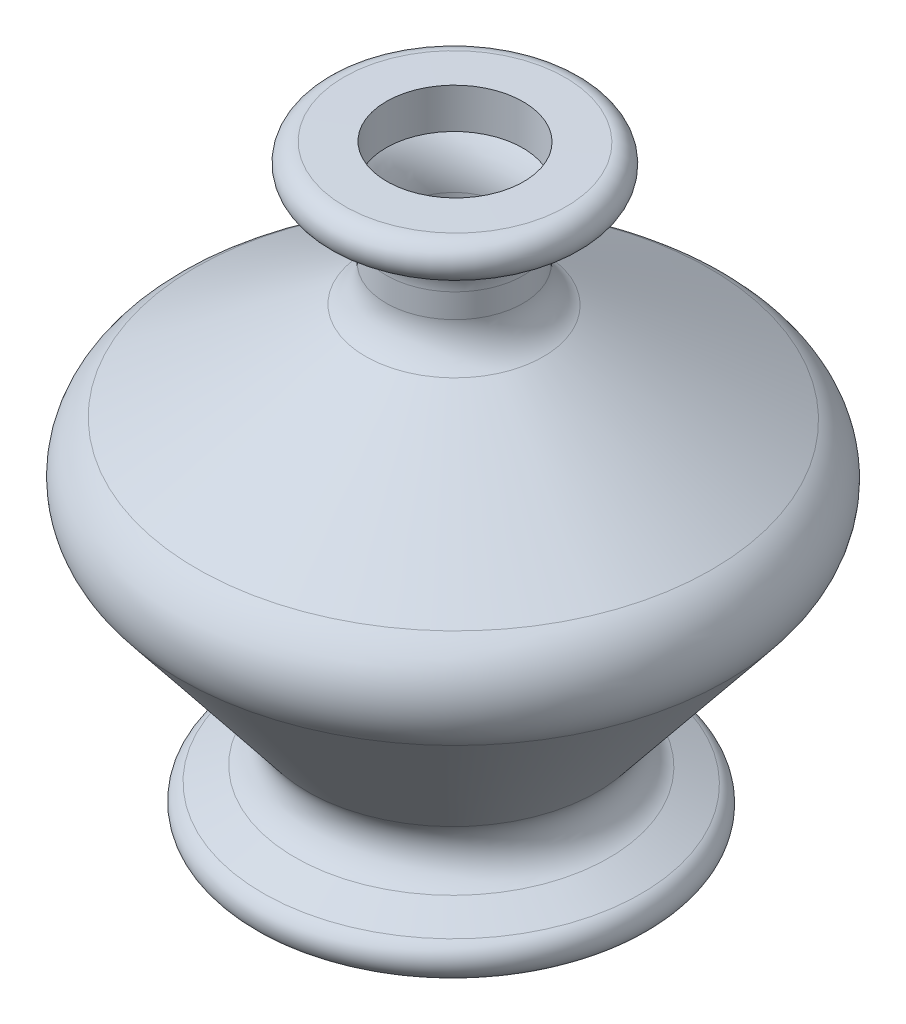
ISO-10303-21;
HEADER;
FILE_DESCRIPTION(('STEP AP214'),'2;1');
FILE_NAME('part.step','',(''),(''),'','','');
FILE_SCHEMA(('AUTOMOTIVE_DESIGN { 1 0 10303 214 1 1 1 1 }'));
ENDSEC;
DATA;
#1=APPLICATION_CONTEXT('core data for automotive mechanical design processes');
#2=APPLICATION_PROTOCOL_DEFINITION('international standard','automotive_design',2000,#1);
#3=PRODUCT_CONTEXT('',#1,'mechanical');
#4=PRODUCT('Part','Part','',(#3));
#5=PRODUCT_RELATED_PRODUCT_CATEGORY('part','',(#4));
#6=PRODUCT_DEFINITION_FORMATION('','',#4);
#7=PRODUCT_DEFINITION_CONTEXT('part definition',#1,'design');
#8=PRODUCT_DEFINITION('design','',#6,#7);
#9=PRODUCT_DEFINITION_SHAPE('','',#8);
#10=(LENGTH_UNIT() NAMED_UNIT(*) SI_UNIT(.MILLI.,.METRE.));
#11=(NAMED_UNIT(*) PLANE_ANGLE_UNIT() SI_UNIT($,.RADIAN.));
#12=(NAMED_UNIT(*) SI_UNIT($,.STERADIAN.) SOLID_ANGLE_UNIT());
#13=UNCERTAINTY_MEASURE_WITH_UNIT(LENGTH_MEASURE(1.E-05),#10,'distance_accuracy_value','');
#14=(GEOMETRIC_REPRESENTATION_CONTEXT(3) GLOBAL_UNCERTAINTY_ASSIGNED_CONTEXT((#13)) GLOBAL_UNIT_ASSIGNED_CONTEXT((#10,
#11,#12)) REPRESENTATION_CONTEXT('',''));
#15=CARTESIAN_POINT('',(0.,0.,0.));
#16=DIRECTION('',(0.,0.,1.));
#17=DIRECTION('',(1.,0.,0.));
#18=AXIS2_PLACEMENT_3D('',#15,#16,#17);
#19=CARTESIAN_POINT('',(-1.06157522456295,-98.6303173315967,0.));
#20=DIRECTION('',(0.00682786330255889,0.99997668986968,0.));
#21=DIRECTION('',(-0.99997668986968,0.00682786330255889,0.));
#22=AXIS2_PLACEMENT_3D('',#19,#20,#21);
#23=CYLINDRICAL_SURFACE('',#22,14.1554701523642);
#24=CARTESIAN_POINT('',(-0.195224617022716,28.2513108448182,0.));
#25=DIRECTION('',(0.00682786330255889,0.99997668986968,0.));
#26=DIRECTION('',(-0.99997668986968,0.00682786330255889,0.));
#27=AXIS2_PLACEMENT_3D('',#24,#25,#26);
#28=CIRCLE('',#27,14.1554701523587);
#29=CARTESIAN_POINT('',(-14.3503648035274,28.347962460002,0.));
#30=VERTEX_POINT('',#29);
#31=EDGE_CURVE('E145',#30,#30,#28,.T.);
#32=ORIENTED_EDGE('',*,*,#31,.F.);
#33=EDGE_LOOP('',(#32));
#34=FACE_BOUND('',#33,.T.);
#35=CARTESIAN_POINT('',(-0.150675963278453,34.7756967815788,0.));
#36=DIRECTION('',(0.00682786330255889,0.99997668986968,0.));
#37=DIRECTION('',(-0.99997668986968,0.00682786330255889,0.));
#38=AXIS2_PLACEMENT_3D('',#35,#36,#37);
#39=CIRCLE('',#38,14.1554701523697);
#40=CARTESIAN_POINT('',(-14.3058161497942,34.8723483967626,0.));
#41=VERTEX_POINT('',#40);
#42=EDGE_CURVE('E11',#41,#41,#39,.T.);
#43=ORIENTED_EDGE('',*,*,#42,.T.);
#44=EDGE_LOOP('',(#43));
#45=FACE_BOUND('',#44,.T.);
#46=ADVANCED_FACE('F43',(#34,#45),#23,.F.);
#47=CARTESIAN_POINT('',(-0.150675963278644,34.7756967815509,0.));
#48=DIRECTION('',(0.00682786330255889,0.99997668986968,0.));
#49=DIRECTION('',(-0.99997668986968,0.00682786330255889,0.));
#50=AXIS2_PLACEMENT_3D('',#47,#48,#49);
#51=TOROIDAL_SURFACE('',#50,30.5554701523697,16.4);
#52=CARTESIAN_POINT('',(-0.074350345880984,45.953987098079,0.));
#53=DIRECTION('',(0.00682786330255889,0.99997668986968,0.));
#54=DIRECTION('',(-0.99997668986968,0.00682786330255889,0.));
#55=AXIS2_PLACEMENT_3D('',#52,#53,#54);
#56=CIRCLE('',#55,18.5554701523887);
#57=CARTESIAN_POINT('',(-18.6293879678423,46.0806813117942,0.));
#58=VERTEX_POINT('',#57);
#59=EDGE_CURVE('E50',#58,#58,#56,.T.);
#60=ORIENTED_EDGE('',*,*,#59,.T.);
#61=EDGE_LOOP('',(#60));
#62=FACE_BOUND('',#61,.T.);
#63=ORIENTED_EDGE('',*,*,#42,.F.);
#64=EDGE_LOOP('',(#63));
#65=FACE_BOUND('',#64,.T.);
#66=ADVANCED_FACE('F111',(#62,#65),#51,.T.);
#67=CARTESIAN_POINT('',(-1.06157522456295,-98.6303173315967,0.));
#68=DIRECTION('',(0.00682786330255889,0.99997668986968,0.));
#69=DIRECTION('',(-0.99997668986968,0.00682786330255889,0.));
#70=AXIS2_PLACEMENT_3D('',#67,#68,#69);
#71=CYLINDRICAL_SURFACE('',#70,18.5554701523979);
#72=ORIENTED_EDGE('',*,*,#59,.F.);
#73=EDGE_LOOP('',(#72));
#74=FACE_BOUND('',#73,.T.);
#75=CARTESIAN_POINT('',(5.56011400115741E-11,56.8429884628937,0.));
#76=DIRECTION('',(0.00682786330255889,0.99997668986968,0.));
#77=DIRECTION('',(-0.99997668986968,0.00682786330255889,0.));
#78=AXIS2_PLACEMENT_3D('',#75,#76,#77);
#79=CIRCLE('',#78,18.5554701524072);
#80=CARTESIAN_POINT('',(-18.5550376219242,56.969682676609,0.));
#81=VERTEX_POINT('',#80);
#82=EDGE_CURVE('E106',#81,#81,#79,.T.);
#83=ORIENTED_EDGE('',*,*,#82,.T.);
#84=EDGE_LOOP('',(#83));
#85=FACE_BOUND('',#84,.T.);
#86=ADVANCED_FACE('F114',(#74,#85),#71,.F.);
#87=CARTESIAN_POINT('',(-0.00053356085472642,56.764845645835,0.));
#88=DIRECTION('',(-0.00682786330255889,-0.99997668986968,0.));
#89=DIRECTION('',(0.99997668986968,-0.00682786330255889,0.));
#90=AXIS2_PLACEMENT_3D('',#87,#88,#89);
#91=CONICAL_SURFACE('',#90,30.0001657469065,1.56396841043905);
#92=ORIENTED_EDGE('',*,*,#82,.F.);
#93=EDGE_LOOP('',(#92));
#94=FACE_BOUND('',#93,.T.);
#95=CARTESIAN_POINT('',(-0.00053356085472642,56.764845645835,0.));
#96=DIRECTION('',(0.00682786330255889,0.99997668986968,0.));
#97=DIRECTION('',(-0.99997668986968,0.00682786330255889,0.));
#98=AXIS2_PLACEMENT_3D('',#95,#96,#97);
#99=CIRCLE('',#98,30.0001657469065);
#100=CARTESIAN_POINT('',(-29.9999999999881,56.969682676609,0.));
#101=VERTEX_POINT('',#100);
#102=EDGE_CURVE('E103',#101,#101,#99,.T.);
#103=ORIENTED_EDGE('',*,*,#102,.T.);
#104=EDGE_LOOP('',(#103));
#105=FACE_BOUND('',#104,.T.);
#106=ADVANCED_FACE('F117',(#94,#105),#91,.T.);
#107=CARTESIAN_POINT('',(-0.0346720815756034,51.7650787444214,0.));
#108=DIRECTION('',(0.00682786330255889,0.99997668986968,0.));
#109=DIRECTION('',(-0.99997668986968,0.00682786330255889,0.));
#110=AXIS2_PLACEMENT_3D('',#107,#108,#109);
#111=TOROIDAL_SURFACE('',#110,29.9660264303937,5.);
#112=CARTESIAN_POINT('',(-0.0688106022964814,46.7653118430079,0.));
#113=DIRECTION('',(0.00682786330255889,0.99997668986968,0.));
#114=DIRECTION('',(-0.99997668986968,0.00682786330255889,0.));
#115=AXIS2_PLACEMENT_3D('',#112,#113,#114);
#116=CIRCLE('',#115,29.9318871138809);
#117=CARTESIAN_POINT('',(-29.9999999999881,46.9696826766091,0.));
#118=VERTEX_POINT('',#117);
#119=EDGE_CURVE('E100',#118,#118,#116,.T.);
#120=ORIENTED_EDGE('',*,*,#119,.T.);
#121=EDGE_LOOP('',(#120));
#122=FACE_BOUND('',#121,.T.);
#123=ORIENTED_EDGE('',*,*,#102,.F.);
#124=EDGE_LOOP('',(#123));
#125=FACE_BOUND('',#124,.T.);
#126=ADVANCED_FACE('F123',(#122,#125),#111,.T.);
#127=CARTESIAN_POINT('',(-0.0688158611971046,46.7645416491998,0.));
#128=DIRECTION('',(-0.00682786330255889,-0.99997668986968,0.));
#129=DIRECTION('',(0.99997668986968,-0.00682786330255889,0.));
#130=AXIS2_PLACEMENT_3D('',#127,#128,#129);
#131=CONICAL_SURFACE('',#130,30.0446886996562,1.56396841043884);
#132=ORIENTED_EDGE('',*,*,#119,.F.);
#133=EDGE_LOOP('',(#132));
#134=FACE_BOUND('',#133,.T.);
#135=CARTESIAN_POINT('',(-0.0688158611971046,46.7645416491998,0.));
#136=DIRECTION('',(0.00682786330255889,0.99997668986968,0.));
#137=DIRECTION('',(-0.99997668986968,0.00682786330255889,0.));
#138=AXIS2_PLACEMENT_3D('',#135,#136,#137);
#139=CIRCLE('',#138,30.0446886996562);
#140=CARTESIAN_POINT('',(-30.1128042152443,46.969682676609,0.));
#141=VERTEX_POINT('',#140);
#142=EDGE_CURVE('E97',#141,#141,#139,.T.);
#143=ORIENTED_EDGE('',*,*,#142,.T.);
#144=EDGE_LOOP('',(#143));
#145=FACE_BOUND('',#144,.T.);
#146=ADVANCED_FACE('F128',(#134,#145),#131,.T.);
#147=CARTESIAN_POINT('',(-0.150675963278644,34.7756967815509,0.));
#148=DIRECTION('',(0.00682786330255889,0.99997668986968,0.));
#149=DIRECTION('',(-0.99997668986968,0.00682786330255889,0.));
#150=AXIS2_PLACEMENT_3D('',#147,#148,#149);
#151=TOROIDAL_SURFACE('',#150,30.5554701523697,12.0000000012208);
#152=ORIENTED_EDGE('',*,*,#142,.F.);
#153=EDGE_LOOP('',(#152));
#154=FACE_BOUND('',#153,.T.);
#155=CARTESIAN_POINT('',(-0.150675963278504,34.7756967815713,0.));
#156=DIRECTION('',(0.00682786330255889,0.99997668986968,0.));
#157=DIRECTION('',(-0.99997668986968,0.00682786330255889,0.));
#158=AXIS2_PLACEMENT_3D('',#155,#156,#157);
#159=CIRCLE('',#158,18.5554701523697);
#160=CARTESIAN_POINT('',(-18.7057135852208,34.9023909952864,0.));
#161=VERTEX_POINT('',#160);
#162=EDGE_CURVE('E94',#161,#161,#159,.T.);
#163=ORIENTED_EDGE('',*,*,#162,.T.);
#164=EDGE_LOOP('',(#163));
#165=FACE_BOUND('',#164,.T.);
#166=ADVANCED_FACE('F134',(#154,#165),#151,.F.);
#167=CARTESIAN_POINT('',(-1.06157522456295,-98.6303173315967,0.));
#168=DIRECTION('',(0.00682786330255889,0.99997668986968,0.));
#169=DIRECTION('',(-0.99997668986968,0.00682786330255889,0.));
#170=AXIS2_PLACEMENT_3D('',#167,#168,#169);
#171=CYLINDRICAL_SURFACE('',#170,18.5554701523642);
#172=CARTESIAN_POINT('',(-0.195224617022771,28.2513108448102,0.));
#173=DIRECTION('',(0.00682786330255889,0.99997668986968,0.));
#174=DIRECTION('',(-0.99997668986968,0.00682786330255889,0.));
#175=AXIS2_PLACEMENT_3D('',#172,#173,#174);
#176=CIRCLE('',#175,18.5554701523587);
#177=CARTESIAN_POINT('',(-18.750262238954,28.3780050585252,0.));
#178=VERTEX_POINT('',#177);
#179=EDGE_CURVE('E91',#178,#178,#176,.T.);
#180=ORIENTED_EDGE('',*,*,#179,.T.);
#181=EDGE_LOOP('',(#180));
#182=FACE_BOUND('',#181,.T.);
#183=ORIENTED_EDGE('',*,*,#162,.F.);
#184=EDGE_LOOP('',(#183));
#185=FACE_BOUND('',#184,.T.);
#186=ADVANCED_FACE('F218',(#182,#185),#171,.T.);
#187=CARTESIAN_POINT('',(-0.195224617022913,28.2513108447897,0.));
#188=DIRECTION('',(0.00682786330255889,0.99997668986968,0.));
#189=DIRECTION('',(-0.99997668986968,0.00682786330255889,0.));
#190=AXIS2_PLACEMENT_3D('',#187,#188,#189);
#191=TOROIDAL_SURFACE('',#190,29.8054701523587,11.25);
#192=ORIENTED_EDGE('',*,*,#179,.F.);
#193=EDGE_LOOP('',(#192));
#194=FACE_BOUND('',#193,.T.);
#195=CARTESIAN_POINT('',(-0.261483240044998,18.5473850939449,0.));
#196=DIRECTION('',(0.00682786330255889,0.99997668986968,0.));
#197=DIRECTION('',(-0.99997668986968,0.00682786330255889,0.));
#198=AXIS2_PLACEMENT_3D('',#195,#196,#197);
#199=CIRCLE('',#198,24.1140788622639);
#200=CARTESIAN_POINT('',(-24.3749999999881,18.7120327280836,0.));
#201=VERTEX_POINT('',#200);
#202=EDGE_CURVE('E88',#201,#201,#199,.T.);
#203=ORIENTED_EDGE('',*,*,#202,.T.);
#204=EDGE_LOOP('',(#203));
#205=FACE_BOUND('',#204,.T.);
#206=ADVANCED_FACE('F214',(#194,#205),#191,.F.);
#207=CARTESIAN_POINT('',(-0.261483240044998,18.5473850939449,0.));
#208=DIRECTION('',(-0.00682786330255889,-0.99997668986968,0.));
#209=DIRECTION('',(0.99997668986968,-0.00682786330255889,0.));
#210=AXIS2_PLACEMENT_3D('',#207,#208,#209);
#211=CONICAL_SURFACE('',#210,24.1140788622639,1.04036963484075);
#212=CARTESIAN_POINT('',(-0.444460106448989,-8.25054466554753,0.));
#213=DIRECTION('',(0.00682786330255889,0.99997668986968,0.));
#214=DIRECTION('',(-0.99997668986968,0.00682786330255889,0.));
#215=AXIS2_PLACEMENT_3D('',#212,#213,#214);
#216=CIRCLE('',#215,69.8071671077132);
#217=CARTESIAN_POINT('',(-70.2499999999996,-7.77391087099718,0.));
#218=VERTEX_POINT('',#217);
#219=EDGE_CURVE('E85',#218,#218,#216,.T.);
#220=ORIENTED_EDGE('',*,*,#219,.T.);
#221=EDGE_LOOP('',(#220));
#222=FACE_BOUND('',#221,.T.);
#223=ORIENTED_EDGE('',*,*,#202,.F.);
#224=EDGE_LOOP('',(#223));
#225=FACE_BOUND('',#224,.T.);
#226=ADVANCED_FACE('F210',(#222,#225),#211,.T.);
#227=CARTESIAN_POINT('',(-0.538694592524848,-22.0516835111935,0.));
#228=DIRECTION('',(0.00682786330255889,0.99997668986968,0.));
#229=DIRECTION('',(-0.99997668986968,0.00682786330255889,0.));
#230=AXIS2_PLACEMENT_3D('',#227,#228,#229);
#231=TOROIDAL_SURFACE('',#230,61.7127439395784,16.);
#232=CARTESIAN_POINT('',(-0.606638386802283,-32.002411504426,0.));
#233=DIRECTION('',(0.00682786330255889,0.99997668986968,0.));
#234=DIRECTION('',(-0.99997668986968,0.00682786330255889,0.));
#235=AXIS2_PLACEMENT_3D('',#232,#233,#234);
#236=CIRCLE('',#235,74.2418459044248);
#237=CARTESIAN_POINT('',(-74.8467537041238,-31.495498329261,0.));
#238=VERTEX_POINT('',#237);
#239=EDGE_CURVE('E82',#238,#238,#236,.T.);
#240=ORIENTED_EDGE('',*,*,#239,.T.);
#241=EDGE_LOOP('',(#240));
#242=FACE_BOUND('',#241,.T.);
#243=ORIENTED_EDGE('',*,*,#219,.F.);
#244=EDGE_LOOP('',(#243));
#245=FACE_BOUND('',#244,.T.);
#246=ADVANCED_FACE('F206',(#242,#245),#231,.T.);
#247=CARTESIAN_POINT('',(-0.606638386802283,-32.002411504426,0.));
#248=DIRECTION('',(0.00682786330255889,0.99997668986968,0.));
#249=DIRECTION('',(-0.99997668986968,0.00682786330255889,0.));
#250=AXIS2_PLACEMENT_3D('',#247,#248,#249);
#251=CONICAL_SURFACE('',#250,74.2418459044248,0.671211328790154);
#252=CARTESIAN_POINT('',(-0.90739084989184,-76.049200255709,0.));
#253=DIRECTION('',(0.00682786330255889,0.99997668986968,0.));
#254=DIRECTION('',(-0.99997668986968,0.00682786330255889,0.));
#255=AXIS2_PLACEMENT_3D('',#252,#253,#254);
#256=CIRCLE('',#255,39.2578502970231);
#257=CARTESIAN_POINT('',(-40.1643260413084,-75.7811530203286,0.));
#258=VERTEX_POINT('',#257);
#259=EDGE_CURVE('E79',#258,#258,#256,.T.);
#260=ORIENTED_EDGE('',*,*,#259,.T.);
#261=EDGE_LOOP('',(#260));
#262=FACE_BOUND('',#261,.T.);
#263=ORIENTED_EDGE('',*,*,#239,.F.);
#264=EDGE_LOOP('',(#263));
#265=FACE_BOUND('',#264,.T.);
#266=ADVANCED_FACE('F202',(#262,#265),#251,.T.);
#267=CARTESIAN_POINT('',(-0.945609234172896,-81.6464847519023,0.));
#268=DIRECTION('',(0.00682786330255889,0.99997668986968,0.));
#269=DIRECTION('',(-0.99997668986968,0.00682786330255889,0.));
#270=AXIS2_PLACEMENT_3D('',#267,#268,#269);
#271=TOROIDAL_SURFACE('',#270,46.3054701522492,9.00000000000002);
#272=ORIENTED_EDGE('',*,*,#259,.F.);
#273=EDGE_LOOP('',(#272));
#274=FACE_BOUND('',#273,.T.);
#275=CARTESIAN_POINT('',(-1.00147937860931,-89.8289628743219,0.));
#276=DIRECTION('',(0.00682786330255889,0.99997668986968,0.));
#277=DIRECTION('',(-0.99997668986968,0.00682786330255889,0.));
#278=AXIS2_PLACEMENT_3D('',#275,#276,#277);
#279=CIRCLE('',#278,42.5579469297615);
#280=CARTESIAN_POINT('',(-43.5584342770817,-89.538383030248,0.));
#281=VERTEX_POINT('',#280);
#282=EDGE_CURVE('E70',#281,#281,#279,.T.);
#283=ORIENTED_EDGE('',*,*,#282,.T.);
#284=EDGE_LOOP('',(#283));
#285=FACE_BOUND('',#284,.T.);
#286=ADVANCED_FACE('F198',(#274,#285),#271,.F.);
#287=CARTESIAN_POINT('',(-1.00147937860931,-89.8289628743219,0.));
#288=DIRECTION('',(-0.00682786330255889,-0.99997668986968,0.));
#289=DIRECTION('',(0.99997668986968,-0.00682786330255889,0.));
#290=AXIS2_PLACEMENT_3D('',#287,#288,#289);
#291=CONICAL_SURFACE('',#290,42.5579469297615,1.14132360225847);
#292=CARTESIAN_POINT('',(-1.02873278340151,-93.8203681359898,0.));
#293=DIRECTION('',(0.00682786330255889,0.99997668986968,0.));
#294=DIRECTION('',(-0.99997668986968,0.00682786330255889,0.));
#295=AXIS2_PLACEMENT_3D('',#292,#293,#294);
#296=CIRCLE('',#295,51.2733322506533);
#297=CARTESIAN_POINT('',(-52.3008698459981,-93.4702808323157,0.));
#298=VERTEX_POINT('',#297);
#299=EDGE_CURVE('E66',#298,#298,#296,.T.);
#300=ORIENTED_EDGE('',*,*,#299,.T.);
#301=EDGE_LOOP('',(#300));
#302=FACE_BOUND('',#301,.T.);
#303=ORIENTED_EDGE('',*,*,#282,.F.);
#304=EDGE_LOOP('',(#303));
#305=FACE_BOUND('',#304,.T.);
#306=ADVANCED_FACE('F195',(#302,#305),#291,.T.);
#307=CARTESIAN_POINT('',(-1.05977175253284,-98.3661893151118,0.));
#308=DIRECTION('',(0.00682786330255889,0.99997668986968,0.));
#309=DIRECTION('',(-0.99997668986968,0.00682786330255889,0.));
#310=AXIS2_PLACEMENT_3D('',#307,#308,#309);
#311=TOROIDAL_SURFACE('',#310,49.1913749048268,4.99999999999999);
#312=CARTESIAN_POINT('',(-1.09391027325372,-103.365956216525,0.));
#313=DIRECTION('',(0.00682786330255889,0.99997668986968,0.));
#314=DIRECTION('',(-0.99997668986968,0.00682786330255889,0.));
#315=AXIS2_PLACEMENT_3D('',#312,#313,#314);
#316=CIRCLE('',#315,49.157235588314);
#317=CARTESIAN_POINT('',(-50.25,-103.030317331597,0.));
#318=VERTEX_POINT('',#317);
#319=EDGE_CURVE('E64',#318,#318,#316,.T.);
#320=ORIENTED_EDGE('',*,*,#319,.T.);
#321=EDGE_LOOP('',(#320));
#322=FACE_BOUND('',#321,.T.);
#323=ORIENTED_EDGE('',*,*,#299,.F.);
#324=EDGE_LOOP('',(#323));
#325=FACE_BOUND('',#324,.T.);
#326=ADVANCED_FACE('F60',(#322,#325),#311,.T.);
#327=CARTESIAN_POINT('',(-1.09391027325372,-103.365956216525,0.));
#328=DIRECTION('',(-0.00682786330255889,-0.99997668986968,0.));
#329=DIRECTION('',(0.99997668986968,-0.00682786330255889,0.));
#330=AXIS2_PLACEMENT_3D('',#327,#328,#329);
#331=CONICAL_SURFACE('',#330,49.157235588314,1.56396841043905);
#332=CARTESIAN_POINT('',(-1.09161852340742,-103.030317331597,0.));
#333=VERTEX_POINT('',#332);
#334=VERTEX_LOOP('',#333);
#335=FACE_BOUND('',#334,.T.);
#336=ORIENTED_EDGE('',*,*,#319,.F.);
#337=EDGE_LOOP('',(#336));
#338=FACE_BOUND('',#337,.T.);
#339=ADVANCED_FACE('F56',(#335,#338),#331,.F.);
#340=CARTESIAN_POINT('',(-1.06386837501935,-98.9661613432815,0.));
#341=DIRECTION('',(-0.00682786330255889,-0.99997668986968,0.));
#342=DIRECTION('',(0.99997668986968,-0.00682786330255889,0.));
#343=AXIS2_PLACEMENT_3D('',#340,#341,#342);
#344=CONICAL_SURFACE('',#343,49.1872781868453,1.56396841043905);
#345=CARTESIAN_POINT('',(-1.06157522456295,-98.6303173315967,0.));
#346=VERTEX_POINT('',#345);
#347=VERTEX_LOOP('',#346);
#348=FACE_BOUND('',#347,.T.);
#349=CARTESIAN_POINT('',(-1.06386837501935,-98.9661613432815,0.));
#350=DIRECTION('',(0.00682786330255889,0.99997668986968,0.));
#351=DIRECTION('',(-0.99997668986968,0.00682786330255889,0.));
#352=AXIS2_PLACEMENT_3D('',#349,#350,#351);
#353=CIRCLE('',#352,49.1872781868453);
#354=CARTESIAN_POINT('',(-50.25,-98.6303173315967,0.));
#355=VERTEX_POINT('',#354);
#356=EDGE_CURVE('E67',#355,#355,#353,.T.);
#357=ORIENTED_EDGE('',*,*,#356,.T.);
#358=EDGE_LOOP('',(#357));
#359=FACE_BOUND('',#358,.T.);
#360=ADVANCED_FACE('F59',(#348,#359),#344,.T.);
#361=CARTESIAN_POINT('',(-1.05977175253284,-98.3661893151118,0.));
#362=DIRECTION('',(0.00682786330255889,0.99997668986968,0.));
#363=DIRECTION('',(-0.99997668986968,0.00682786330255889,0.));
#364=AXIS2_PLACEMENT_3D('',#361,#362,#363);
#365=TOROIDAL_SURFACE('',#364,49.1913749048268,0.600000000000003);
#366=ORIENTED_EDGE('',*,*,#356,.F.);
#367=EDGE_LOOP('',(#366));
#368=FACE_BOUND('',#367,.T.);
#369=CARTESIAN_POINT('',(-1.05604707623708,-97.8206907736172,0.));
#370=DIRECTION('',(0.00682786330255889,0.99997668986968,0.));
#371=DIRECTION('',(-0.99997668986968,0.00682786330255889,0.));
#372=AXIS2_PLACEMENT_3D('',#369,#370,#371);
#373=CIRCLE('',#372,49.441209786326);
#374=CARTESIAN_POINT('',(-50.4961043815198,-97.483112951683,0.));
#375=VERTEX_POINT('',#374);
#376=EDGE_CURVE('E73',#375,#375,#373,.T.);
#377=ORIENTED_EDGE('',*,*,#376,.T.);
#378=EDGE_LOOP('',(#377));
#379=FACE_BOUND('',#378,.T.);
#380=ADVANCED_FACE('F167',(#368,#379),#365,.F.);
#381=CARTESIAN_POINT('',(-1.02879367144488,-93.8292855119493,0.));
#382=DIRECTION('',(-0.00682786330255889,-0.99997668986968,0.));
#383=DIRECTION('',(0.99997668986968,-0.00682786330255889,0.));
#384=AXIS2_PLACEMENT_3D('',#381,#382,#383);
#385=CONICAL_SURFACE('',#384,40.7258244654342,1.14132360225847);
#386=ORIENTED_EDGE('',*,*,#376,.F.);
#387=EDGE_LOOP('',(#386));
#388=FACE_BOUND('',#387,.T.);
#389=CARTESIAN_POINT('',(-1.02879367144488,-93.8292855119493,0.));
#390=DIRECTION('',(0.00682786330255889,0.99997668986968,0.));
#391=DIRECTION('',(-0.99997668986968,0.00682786330255889,0.));
#392=AXIS2_PLACEMENT_3D('',#389,#390,#391);
#393=CIRCLE('',#392,40.7258244654342);
#394=CARTESIAN_POINT('',(-41.7536688126034,-93.5512151496153,0.));
#395=VERTEX_POINT('',#394);
#396=EDGE_CURVE('E162',#395,#395,#393,.T.);
#397=ORIENTED_EDGE('',*,*,#396,.T.);
#398=EDGE_LOOP('',(#397));
#399=FACE_BOUND('',#398,.T.);
#400=ADVANCED_FACE('F169',(#388,#399),#385,.F.);
#401=CARTESIAN_POINT('',(-0.945609234172896,-81.6464847519023,0.));
#402=DIRECTION('',(0.00682786330255889,0.99997668986968,0.));
#403=DIRECTION('',(-0.99997668986968,0.00682786330255889,0.));
#404=AXIS2_PLACEMENT_3D('',#401,#402,#403);
#405=TOROIDAL_SURFACE('',#404,46.3054701522492,13.4);
#406=CARTESIAN_POINT('',(-0.888706306465545,-73.31275005757,0.));
#407=DIRECTION('',(0.00682786330255889,0.99997668986968,0.));
#408=DIRECTION('',(-0.99997668986968,0.00682786330255889,0.));
#409=AXIS2_PLACEMENT_3D('',#406,#407,#408);
#410=CIRCLE('',#409,35.8123472566904);
#411=CARTESIAN_POINT('',(-36.7002187726743,-73.0682282459576,0.));
#412=VERTEX_POINT('',#411);
#413=EDGE_CURVE('E159',#412,#412,#410,.T.);
#414=ORIENTED_EDGE('',*,*,#413,.T.);
#415=EDGE_LOOP('',(#414));
#416=FACE_BOUND('',#415,.T.);
#417=ORIENTED_EDGE('',*,*,#396,.F.);
#418=EDGE_LOOP('',(#417));
#419=FACE_BOUND('',#418,.T.);
#420=ADVANCED_FACE('F172',(#416,#419),#405,.T.);
#421=CARTESIAN_POINT('',(-0.587953843375987,-29.2659613062871,0.));
#422=DIRECTION('',(0.00682786330255889,0.99997668986968,0.));
#423=DIRECTION('',(-0.99997668986968,0.00682786330255889,0.));
#424=AXIS2_PLACEMENT_3D('',#421,#422,#423);
#425=CONICAL_SURFACE('',#424,70.7963428640921,0.671211328790154);
#426=ORIENTED_EDGE('',*,*,#413,.F.);
#427=EDGE_LOOP('',(#426));
#428=FACE_BOUND('',#427,.T.);
#429=CARTESIAN_POINT('',(-0.587953843375987,-29.2659613062871,0.));
#430=DIRECTION('',(0.00682786330255889,0.99997668986968,0.));
#431=DIRECTION('',(-0.99997668986968,0.00682786330255889,0.));
#432=AXIS2_PLACEMENT_3D('',#429,#430,#431);
#433=CIRCLE('',#432,70.796342864092);
#434=CARTESIAN_POINT('',(-71.3826464354897,-28.78257355489,0.));
#435=VERTEX_POINT('',#434);
#436=EDGE_CURVE('E156',#435,#435,#433,.T.);
#437=ORIENTED_EDGE('',*,*,#436,.T.);
#438=EDGE_LOOP('',(#437));
#439=FACE_BOUND('',#438,.T.);
#440=ADVANCED_FACE('F177',(#428,#439),#425,.F.);
#441=CARTESIAN_POINT('',(-0.538694592524848,-22.0516835111935,0.));
#442=DIRECTION('',(0.00682786330255889,0.99997668986968,0.));
#443=DIRECTION('',(-0.99997668986968,0.00682786330255889,0.));
#444=AXIS2_PLACEMENT_3D('',#441,#442,#443);
#445=TOROIDAL_SURFACE('',#444,61.7127439395784,11.6);
#446=ORIENTED_EDGE('',*,*,#436,.F.);
#447=EDGE_LOOP('',(#446));
#448=FACE_BOUND('',#447,.T.);
#449=CARTESIAN_POINT('',(-0.470374590119849,-12.0458578481002,0.));
#450=DIRECTION('',(0.00682786330255889,0.99997668986968,0.));
#451=DIRECTION('',(-0.99997668986968,0.00682786330255889,0.));
#452=AXIS2_PLACEMENT_3D('',#449,#450,#451);
#453=CIRCLE('',#452,67.5812007364761);
#454=CARTESIAN_POINT('',(67.1092508197599,-12.5072930485516,0.));
#455=VERTEX_POINT('',#454);
#456=EDGE_CURVE('E151',#455,#455,#453,.T.);
#457=ORIENTED_EDGE('',*,*,#456,.T.);
#458=EDGE_LOOP('',(#457));
#459=FACE_BOUND('',#458,.T.);
#460=ADVANCED_FACE('F183',(#448,#459),#445,.F.);
#461=CARTESIAN_POINT('',(-0.287397723715859,14.7520719113923,0.));
#462=DIRECTION('',(-0.00682786330255889,-0.99997668986968,0.));
#463=DIRECTION('',(0.99997668986968,-0.00682786330255889,0.));
#464=AXIS2_PLACEMENT_3D('',#461,#462,#463);
#465=CONICAL_SURFACE('',#464,21.8881124910268,1.04036963484075);
#466=CARTESIAN_POINT('',(-0.287397723715859,14.7520719113923,0.));
#467=DIRECTION('',(0.00682786330255889,0.99997668986968,0.));
#468=DIRECTION('',(-0.99997668986968,0.00682786330255889,0.));
#469=AXIS2_PLACEMENT_3D('',#466,#467,#468);
#470=CIRCLE('',#469,21.8881124910268);
#471=CARTESIAN_POINT('',(21.6002045525563,14.6026228713525,0.));
#472=VERTEX_POINT('',#471);
#473=EDGE_CURVE('E148',#472,#472,#470,.T.);
#474=CARTESIAN_POINT('',(67.1092508197599,-12.5072930485516,0.));
#475=CARTESIAN_POINT('',(66.6351982544765,-12.2248980910526,0.));
#476=CARTESIAN_POINT('',(66.1611456891931,-11.9425031335536,0.));
#477=CARTESIAN_POINT('',(65.2130405586264,-11.3777132185556,0.));
#478=CARTESIAN_POINT('',(64.738987993343,-11.0953182610566,0.));
#479=CARTESIAN_POINT('',(63.7908828627763,-10.5305283460586,0.));
#480=CARTESIAN_POINT('',(63.3168302974929,-10.2481333885596,0.));
#481=CARTESIAN_POINT('',(62.3687251669262,-9.6833434735616,0.));
#482=CARTESIAN_POINT('',(61.8946726016428,-9.4009485160626,0.));
#483=CARTESIAN_POINT('',(60.9465674710761,-8.8361586010646,0.));
#484=CARTESIAN_POINT('',(60.4725149057927,-8.5537636435656,0.));
#485=CARTESIAN_POINT('',(59.524409775226,-7.98897372856759,0.));
#486=CARTESIAN_POINT('',(59.0503572099426,-7.70657877106859,0.));
#487=CARTESIAN_POINT('',(58.1022520793759,-7.14178885607059,0.));
#488=CARTESIAN_POINT('',(57.6281995140925,-6.85939389857159,0.));
#489=CARTESIAN_POINT('',(56.6800943835258,-6.29460398357358,0.));
#490=CARTESIAN_POINT('',(56.2060418182424,-6.01220902607458,0.));
#491=CARTESIAN_POINT('',(55.2579366876757,-5.44741911107658,0.));
#492=CARTESIAN_POINT('',(54.7838841223923,-5.16502415357758,0.));
#493=CARTESIAN_POINT('',(53.8357789918255,-4.60023423857957,0.));
#494=CARTESIAN_POINT('',(53.3617264265422,-4.31783928108057,0.));
#495=CARTESIAN_POINT('',(52.4136212959754,-3.75304936608257,0.));
#496=CARTESIAN_POINT('',(51.9395687306921,-3.47065440858356,0.));
#497=CARTESIAN_POINT('',(50.9914636001253,-2.90586449358556,0.));
#498=CARTESIAN_POINT('',(50.5174110348419,-2.62346953608656,0.));
#499=CARTESIAN_POINT('',(49.5693059042752,-2.05867962108856,0.));
#500=CARTESIAN_POINT('',(49.0952533389918,-1.77628466358956,0.));
#501=CARTESIAN_POINT('',(48.1471482084251,-1.21149474859156,0.));
#502=CARTESIAN_POINT('',(47.6730956431417,-0.929099791092553,0.));
#503=CARTESIAN_POINT('',(46.724990512575,-0.364309876094548,0.));
#504=CARTESIAN_POINT('',(46.2509379472916,-0.081914918595546,0.));
#505=CARTESIAN_POINT('',(45.3028328167249,0.482874996402457,0.));
#506=CARTESIAN_POINT('',(44.8287802514415,0.765269953901458,0.));
#507=CARTESIAN_POINT('',(43.8806751208747,1.33005986889946,0.));
#508=CARTESIAN_POINT('',(43.4066225555914,1.61245482639846,0.));
#509=CARTESIAN_POINT('',(42.4585174250246,2.17724474139646,0.));
#510=CARTESIAN_POINT('',(41.9844648597413,2.45963969889547,0.));
#511=CARTESIAN_POINT('',(41.0363597291745,3.02442961389347,0.));
#512=CARTESIAN_POINT('',(40.5623071638912,3.30682457139247,0.));
#513=CARTESIAN_POINT('',(39.6142020333244,3.87161448639048,0.));
#514=CARTESIAN_POINT('',(39.1401494680411,4.15400944388948,0.));
#515=CARTESIAN_POINT('',(38.1920443374743,4.71879935888748,0.));
#516=CARTESIAN_POINT('',(37.7179917721909,5.00119431638648,0.));
#517=CARTESIAN_POINT('',(36.7698866416242,5.56598423138449,0.));
#518=CARTESIAN_POINT('',(36.2958340763408,5.84837918888349,0.));
#519=CARTESIAN_POINT('',(35.3477289457741,6.41316910388149,0.));
#520=CARTESIAN_POINT('',(34.8736763804907,6.69556406138049,0.));
#521=CARTESIAN_POINT('',(33.925571249924,7.26035397637849,0.));
#522=CARTESIAN_POINT('',(33.4515186846406,7.5427489338775,0.));
#523=CARTESIAN_POINT('',(32.5034135540739,8.1075388488755,0.));
#524=CARTESIAN_POINT('',(32.0293609887905,8.3899338063745,0.));
#525=CARTESIAN_POINT('',(31.0812558582238,8.9547237213725,0.));
#526=CARTESIAN_POINT('',(30.6072032929404,9.23711867887151,0.));
#527=CARTESIAN_POINT('',(29.6590981623736,9.80190859386951,0.));
#528=CARTESIAN_POINT('',(29.1850455970903,10.0843035513685,0.));
#529=CARTESIAN_POINT('',(28.2369404665235,10.6490934663665,0.));
#530=CARTESIAN_POINT('',(27.7628879012402,10.9314884238655,0.));
#531=CARTESIAN_POINT('',(26.8147827706734,11.4962783388635,0.));
#532=CARTESIAN_POINT('',(26.3407302053901,11.7786732963625,0.));
#533=CARTESIAN_POINT('',(25.3926250748233,12.3434632113605,0.));
#534=CARTESIAN_POINT('',(24.9185725095399,12.6258581688595,0.));
#535=CARTESIAN_POINT('',(23.9704673789732,13.1906480838575,0.));
#536=CARTESIAN_POINT('',(23.4964148136898,13.4730430413565,0.));
#537=CARTESIAN_POINT('',(22.5483096831231,14.0378329563545,0.));
#538=CARTESIAN_POINT('',(22.0742571178397,14.3202279138535,0.));
#539=CARTESIAN_POINT('',(21.6002045525563,14.6026228713525,0.));
#540=B_SPLINE_CURVE_WITH_KNOTS('',3,(#474,#475,#476,#477,#478,#479,#480,#481,#482,#483,#484,
#485,#486,#487,#488,#489,#490,#491,#492,#493,#494,#495,#496,#497,#498,#499,#500,#501,#502,#503,
#504,#505,#506,#507,#508,#509,#510,#511,#512,#513,#514,#515,#516,#517,#518,#519,#520,#521,#522,
#523,#524,#525,#526,#527,#528,#529,#530,#531,#532,#533,#534,#535,#536,#537,#538,#539),
.UNSPECIFIED.,.F.,.F.,(4,2,2,2,2,2,2,2,2,2,2,2,2,2,2,2,2,2,2,2,2,2,2,2,2,2,2,2,2,2,2,2,4),(0.,
1.65537147494257,3.31074294988511,4.96611442482764,6.62148589977019,8.27685737471274,
9.93222884965528,11.5876003245978,13.2429717995404,14.8983432744829,16.5537147494255,
18.209086224368,19.8644576993106,21.5198291742531,23.1752006491957,24.8305721241382,
26.4859435990808,28.1413150740233,29.7966865489658,31.4520580239084,33.1074294988509,
34.7628009737935,36.418172448736,38.0735439236786,39.7289153986211,41.3842868735637,
43.0396583485062,44.6950298234488,46.3504012983913,48.0057727733339,49.6611442482764,
51.316515723219,52.9718871981615),.UNSPECIFIED.);
#541=EDGE_CURVE('BSEAM304',#455,#472,#540,.T.);
#542=ORIENTED_EDGE('',*,*,#456,.F.);
#543=ORIENTED_EDGE('',*,*,#473,.T.);
#544=ORIENTED_EDGE('',*,*,#541,.T.);
#545=ORIENTED_EDGE('',*,*,#541,.F.);
#546=EDGE_LOOP('',(#542,#544,#543,#545));
#547=FACE_BOUND('',#546,.T.);
#548=ADVANCED_FACE('F304',(#547),#465,.F.);
#549=CARTESIAN_POINT('',(-0.195224617022913,28.2513108447897,0.));
#550=DIRECTION('',(0.00682786330255889,0.99997668986968,0.));
#551=DIRECTION('',(-0.99997668986968,0.00682786330255889,0.));
#552=AXIS2_PLACEMENT_3D('',#549,#550,#551);
#553=TOROIDAL_SURFACE('',#552,29.8054701523587,15.65);
#554=ORIENTED_EDGE('',*,*,#31,.T.);
#555=EDGE_LOOP('',(#554));
#556=FACE_BOUND('',#555,.T.);
#557=ORIENTED_EDGE('',*,*,#473,.F.);
#558=EDGE_LOOP('',(#557));
#559=FACE_BOUND('',#558,.T.);
#560=ADVANCED_FACE('F314',(#556,#559),#553,.T.);
#561=CLOSED_SHELL('',(#46,#66,#86,#106,#126,#146,#166,#186,#206,#226,#246,#266,#286,#306,#326,
#339,#360,#380,#400,#420,#440,#460,#548,#560));
#562=MANIFOLD_SOLID_BREP('B2',#561);
#563=ADVANCED_BREP_SHAPE_REPRESENTATION('',(#18,#562),#14);
#564=SHAPE_DEFINITION_REPRESENTATION(#9,#563);
ENDSEC;
END-ISO-10303-21;
